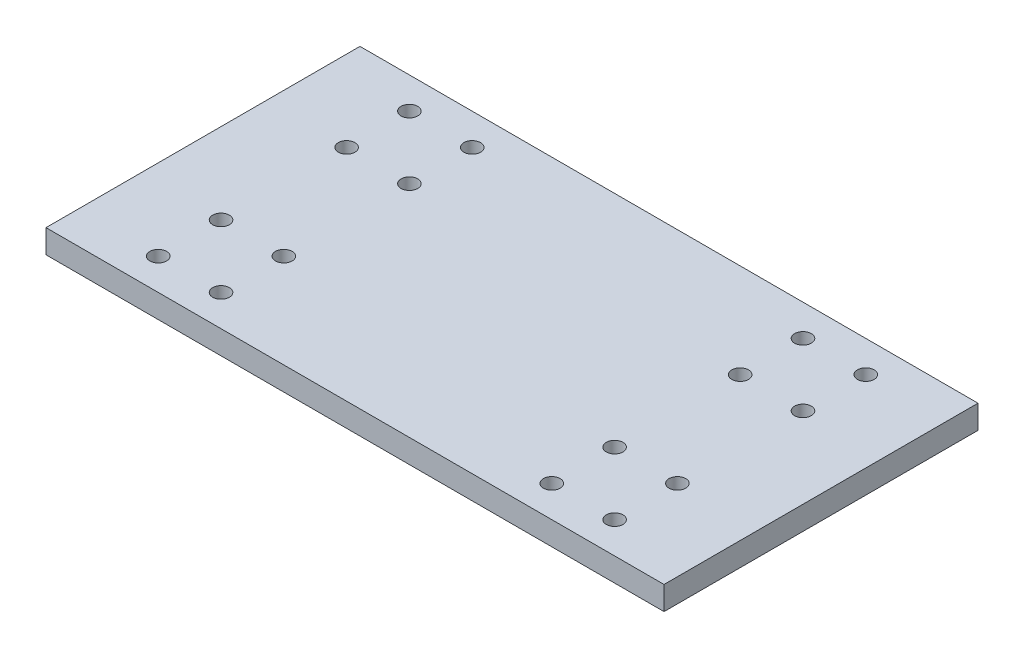
ISO-10303-21;
HEADER;
FILE_DESCRIPTION(('STEP AP214'),'2;1');
FILE_NAME('part.step','',(''),(''),'','','');
FILE_SCHEMA(('AUTOMOTIVE_DESIGN { 1 0 10303 214 1 1 1 1 }'));
ENDSEC;
DATA;
#1=APPLICATION_CONTEXT('core data for automotive mechanical design processes');
#2=APPLICATION_PROTOCOL_DEFINITION('international standard','automotive_design',2000,#1);
#3=PRODUCT_CONTEXT('',#1,'mechanical');
#4=PRODUCT('Part','Part','',(#3));
#5=PRODUCT_RELATED_PRODUCT_CATEGORY('part','',(#4));
#6=PRODUCT_DEFINITION_FORMATION('','',#4);
#7=PRODUCT_DEFINITION_CONTEXT('part definition',#1,'design');
#8=PRODUCT_DEFINITION('design','',#6,#7);
#9=PRODUCT_DEFINITION_SHAPE('','',#8);
#10=(LENGTH_UNIT() NAMED_UNIT(*) SI_UNIT(.MILLI.,.METRE.));
#11=(NAMED_UNIT(*) PLANE_ANGLE_UNIT() SI_UNIT($,.RADIAN.));
#12=(NAMED_UNIT(*) SI_UNIT($,.STERADIAN.) SOLID_ANGLE_UNIT());
#13=UNCERTAINTY_MEASURE_WITH_UNIT(LENGTH_MEASURE(1.E-05),#10,'distance_accuracy_value','');
#14=(GEOMETRIC_REPRESENTATION_CONTEXT(3) GLOBAL_UNCERTAINTY_ASSIGNED_CONTEXT((#13)) GLOBAL_UNIT_ASSIGNED_CONTEXT((#10,
#11,#12)) REPRESENTATION_CONTEXT('',''));
#15=CARTESIAN_POINT('',(0.,0.,0.));
#16=DIRECTION('',(0.,0.,1.));
#17=DIRECTION('',(1.,0.,0.));
#18=AXIS2_PLACEMENT_3D('',#15,#16,#17);
#19=CARTESIAN_POINT('',(49.4976423182434,0.,13.1975325749012));
#20=DIRECTION('',(0.,1.,0.));
#21=DIRECTION('',(1.,0.,0.));
#22=AXIS2_PLACEMENT_3D('',#19,#20,#21);
#23=PLANE('',#22);
#24=CARTESIAN_POINT('',(141.797642318243,0.,-12.2024674250987));
#25=DIRECTION('',(0.,1.,0.));
#26=DIRECTION('',(0.,0.,1.));
#27=AXIS2_PLACEMENT_3D('',#24,#25,#26);
#28=CIRCLE('',#27,3.378);
#29=CARTESIAN_POINT('',(141.797642318243,0.,-15.5804674250987));
#30=VERTEX_POINT('',#29);
#31=EDGE_CURVE('E287',#30,#30,#28,.T.);
#32=ORIENTED_EDGE('',*,*,#31,.T.);
#33=EDGE_LOOP('',(#32));
#34=FACE_BOUND('',#33,.T.);
#35=CARTESIAN_POINT('',(141.797642318243,0.,-37.6024674250987));
#36=DIRECTION('',(0.,1.,0.));
#37=DIRECTION('',(0.,0.,1.));
#38=AXIS2_PLACEMENT_3D('',#35,#36,#37);
#39=CIRCLE('',#38,3.378);
#40=CARTESIAN_POINT('',(141.797642318243,0.,-40.9804674250987));
#41=VERTEX_POINT('',#40);
#42=EDGE_CURVE('E236',#41,#41,#39,.T.);
#43=ORIENTED_EDGE('',*,*,#42,.T.);
#44=EDGE_LOOP('',(#43));
#45=FACE_BOUND('',#44,.T.);
#46=CARTESIAN_POINT('',(116.397642318243,0.,38.5975325749012));
#47=DIRECTION('',(0.,1.,0.));
#48=DIRECTION('',(0.,0.,1.));
#49=AXIS2_PLACEMENT_3D('',#46,#47,#48);
#50=CIRCLE('',#49,3.378);
#51=CARTESIAN_POINT('',(116.397642318243,0.,35.2195325749012));
#52=VERTEX_POINT('',#51);
#53=EDGE_CURVE('E246',#52,#52,#50,.T.);
#54=ORIENTED_EDGE('',*,*,#53,.T.);
#55=EDGE_LOOP('',(#54));
#56=FACE_BOUND('',#55,.T.);
#57=CARTESIAN_POINT('',(141.797642318243,0.,63.9975325749012));
#58=DIRECTION('',(0.,1.,0.));
#59=DIRECTION('',(0.,0.,1.));
#60=AXIS2_PLACEMENT_3D('',#57,#58,#59);
#61=CIRCLE('',#60,3.378);
#62=CARTESIAN_POINT('',(141.797642318243,0.,60.6195325749012));
#63=VERTEX_POINT('',#62);
#64=EDGE_CURVE('E260',#63,#63,#61,.T.);
#65=ORIENTED_EDGE('',*,*,#64,.T.);
#66=EDGE_LOOP('',(#65));
#67=FACE_BOUND('',#66,.T.);
#68=CARTESIAN_POINT('',(-42.8023576817566,0.,63.9975325749012));
#69=DIRECTION('',(0.,1.,0.));
#70=DIRECTION('',(0.,0.,1.));
#71=AXIS2_PLACEMENT_3D('',#68,#69,#70);
#72=CIRCLE('',#71,3.378);
#73=CARTESIAN_POINT('',(-42.8023576817566,0.,60.6195325749012));
#74=VERTEX_POINT('',#73);
#75=EDGE_CURVE('E279',#74,#74,#72,.T.);
#76=ORIENTED_EDGE('',*,*,#75,.T.);
#77=EDGE_LOOP('',(#76));
#78=FACE_BOUND('',#77,.T.);
#79=CARTESIAN_POINT('',(-17.4023576817566,0.,38.5975325749013));
#80=DIRECTION('',(0.,1.,0.));
#81=DIRECTION('',(0.,0.,1.));
#82=AXIS2_PLACEMENT_3D('',#79,#80,#81);
#83=CIRCLE('',#82,3.378);
#84=CARTESIAN_POINT('',(-17.4023576817566,0.,35.2195325749012));
#85=VERTEX_POINT('',#84);
#86=EDGE_CURVE('E187',#85,#85,#83,.T.);
#87=ORIENTED_EDGE('',*,*,#86,.T.);
#88=EDGE_LOOP('',(#87));
#89=FACE_BOUND('',#88,.T.);
#90=CARTESIAN_POINT('',(-17.4023576817566,0.,-12.2024674250987));
#91=DIRECTION('',(0.,1.,0.));
#92=DIRECTION('',(0.,0.,1.));
#93=AXIS2_PLACEMENT_3D('',#90,#91,#92);
#94=CIRCLE('',#93,3.378);
#95=CARTESIAN_POINT('',(-17.4023576817566,0.,-15.5804674250987));
#96=VERTEX_POINT('',#95);
#97=EDGE_CURVE('E189',#96,#96,#94,.T.);
#98=ORIENTED_EDGE('',*,*,#97,.T.);
#99=EDGE_LOOP('',(#98));
#100=FACE_BOUND('',#99,.T.);
#101=CARTESIAN_POINT('',(-17.4023576817566,0.,-37.6024674250987));
#102=DIRECTION('',(0.,1.,0.));
#103=DIRECTION('',(0.,0.,1.));
#104=AXIS2_PLACEMENT_3D('',#101,#102,#103);
#105=CIRCLE('',#104,3.378);
#106=CARTESIAN_POINT('',(-17.4023576817566,0.,-40.9804674250987));
#107=VERTEX_POINT('',#106);
#108=EDGE_CURVE('E211',#107,#107,#105,.T.);
#109=ORIENTED_EDGE('',*,*,#108,.T.);
#110=EDGE_LOOP('',(#109));
#111=FACE_BOUND('',#110,.T.);
#112=CARTESIAN_POINT('',(-42.8023576817566,0.,-37.6024674250987));
#113=DIRECTION('',(0.,1.,0.));
#114=DIRECTION('',(0.,0.,1.));
#115=AXIS2_PLACEMENT_3D('',#112,#113,#114);
#116=CIRCLE('',#115,3.378);
#117=CARTESIAN_POINT('',(-42.8023576817566,0.,-40.9804674250987));
#118=VERTEX_POINT('',#117);
#119=EDGE_CURVE('E173',#118,#118,#116,.T.);
#120=ORIENTED_EDGE('',*,*,#119,.T.);
#121=EDGE_LOOP('',(#120));
#122=FACE_BOUND('',#121,.T.);
#123=CARTESIAN_POINT('',(-42.8023576817566,0.,-12.2024674250988));
#124=DIRECTION('',(0.,1.,0.));
#125=DIRECTION('',(0.,0.,1.));
#126=AXIS2_PLACEMENT_3D('',#123,#124,#125);
#127=CIRCLE('',#126,3.378);
#128=CARTESIAN_POINT('',(-42.8023576817566,0.,-15.5804674250988));
#129=VERTEX_POINT('',#128);
#130=EDGE_CURVE('E216',#129,#129,#127,.T.);
#131=ORIENTED_EDGE('',*,*,#130,.T.);
#132=EDGE_LOOP('',(#131));
#133=FACE_BOUND('',#132,.T.);
#134=CARTESIAN_POINT('',(-42.8023576817566,0.,38.5975325749013));
#135=DIRECTION('',(0.,1.,0.));
#136=DIRECTION('',(0.,0.,1.));
#137=AXIS2_PLACEMENT_3D('',#134,#135,#136);
#138=CIRCLE('',#137,3.378);
#139=CARTESIAN_POINT('',(-42.8023576817566,0.,35.2195325749012));
#140=VERTEX_POINT('',#139);
#141=EDGE_CURVE('E318',#140,#140,#138,.T.);
#142=ORIENTED_EDGE('',*,*,#141,.T.);
#143=EDGE_LOOP('',(#142));
#144=FACE_BOUND('',#143,.T.);
#145=CARTESIAN_POINT('',(-17.4023576817566,0.,63.9975325749012));
#146=DIRECTION('',(0.,1.,0.));
#147=DIRECTION('',(0.,0.,1.));
#148=AXIS2_PLACEMENT_3D('',#145,#146,#147);
#149=CIRCLE('',#148,3.378);
#150=CARTESIAN_POINT('',(-17.4023576817566,0.,60.6195325749012));
#151=VERTEX_POINT('',#150);
#152=EDGE_CURVE('E307',#151,#151,#149,.T.);
#153=ORIENTED_EDGE('',*,*,#152,.T.);
#154=EDGE_LOOP('',(#153));
#155=FACE_BOUND('',#154,.T.);
#156=CARTESIAN_POINT('',(116.397642318243,0.,63.9975325749012));
#157=DIRECTION('',(0.,1.,0.));
#158=DIRECTION('',(0.,0.,1.));
#159=AXIS2_PLACEMENT_3D('',#156,#157,#158);
#160=CIRCLE('',#159,3.378);
#161=CARTESIAN_POINT('',(116.397642318243,0.,60.6195325749012));
#162=VERTEX_POINT('',#161);
#163=EDGE_CURVE('E229',#162,#162,#160,.T.);
#164=ORIENTED_EDGE('',*,*,#163,.T.);
#165=EDGE_LOOP('',(#164));
#166=FACE_BOUND('',#165,.T.);
#167=CARTESIAN_POINT('',(141.797642318243,0.,38.5975325749013));
#168=DIRECTION('',(0.,1.,0.));
#169=DIRECTION('',(0.,0.,1.));
#170=AXIS2_PLACEMENT_3D('',#167,#168,#169);
#171=CIRCLE('',#170,3.378);
#172=CARTESIAN_POINT('',(141.797642318243,0.,35.2195325749012));
#173=VERTEX_POINT('',#172);
#174=EDGE_CURVE('E222',#173,#173,#171,.T.);
#175=ORIENTED_EDGE('',*,*,#174,.T.);
#176=EDGE_LOOP('',(#175));
#177=FACE_BOUND('',#176,.T.);
#178=CARTESIAN_POINT('',(116.397642318243,0.,-12.2024674250987));
#179=DIRECTION('',(0.,1.,0.));
#180=DIRECTION('',(0.,0.,1.));
#181=AXIS2_PLACEMENT_3D('',#178,#179,#180);
#182=CIRCLE('',#181,3.378);
#183=CARTESIAN_POINT('',(116.397642318243,0.,-15.5804674250987));
#184=VERTEX_POINT('',#183);
#185=EDGE_CURVE('E237',#184,#184,#182,.T.);
#186=ORIENTED_EDGE('',*,*,#185,.T.);
#187=EDGE_LOOP('',(#186));
#188=FACE_BOUND('',#187,.T.);
#189=CARTESIAN_POINT('',(116.397642318243,0.,-37.6024674250987));
#190=DIRECTION('',(0.,1.,0.));
#191=DIRECTION('',(0.,0.,1.));
#192=AXIS2_PLACEMENT_3D('',#189,#190,#191);
#193=CIRCLE('',#192,3.378);
#194=CARTESIAN_POINT('',(116.397642318243,0.,-40.9804674250987));
#195=VERTEX_POINT('',#194);
#196=EDGE_CURVE('E303',#195,#195,#193,.T.);
#197=ORIENTED_EDGE('',*,*,#196,.T.);
#198=EDGE_LOOP('',(#197));
#199=FACE_BOUND('',#198,.T.);
#200=DIRECTION('',(-1.,0.,0.));
#201=VECTOR('',#200,1.);
#202=CARTESIAN_POINT('',(174.497642318243,0.,76.6975325749012));
#203=LINE('',#202,#201);
#204=CARTESIAN_POINT('',(174.497642318243,0.,76.6975325749012));
#205=VERTEX_POINT('',#204);
#206=CARTESIAN_POINT('',(-75.5023576817566,0.,76.6975325749012));
#207=VERTEX_POINT('',#206);
#208=EDGE_CURVE('E27',#205,#207,#203,.T.);
#209=ORIENTED_EDGE('',*,*,#208,.T.);
#210=DIRECTION('',(0.,0.,-1.));
#211=VECTOR('',#210,1.);
#212=CARTESIAN_POINT('',(-75.5023576817566,0.,76.6975325749012));
#213=LINE('',#212,#211);
#214=CARTESIAN_POINT('',(-75.5023576817566,0.,-50.3024674250988));
#215=VERTEX_POINT('',#214);
#216=EDGE_CURVE('E295',#207,#215,#213,.T.);
#217=ORIENTED_EDGE('',*,*,#216,.T.);
#218=DIRECTION('',(1.,0.,0.));
#219=VECTOR('',#218,1.);
#220=CARTESIAN_POINT('',(-75.5023576817566,0.,-50.3024674250988));
#221=LINE('',#220,#219);
#222=CARTESIAN_POINT('',(174.497642318243,0.,-50.3024674250988));
#223=VERTEX_POINT('',#222);
#224=EDGE_CURVE('E271',#215,#223,#221,.T.);
#225=ORIENTED_EDGE('',*,*,#224,.T.);
#226=DIRECTION('',(0.,0.,1.));
#227=VECTOR('',#226,1.);
#228=CARTESIAN_POINT('',(174.497642318243,0.,-50.3024674250988));
#229=LINE('',#228,#227);
#230=EDGE_CURVE('E245',#223,#205,#229,.T.);
#231=ORIENTED_EDGE('',*,*,#230,.T.);
#232=EDGE_LOOP('',(#209,#217,#225,#231));
#233=FACE_BOUND('',#232,.T.);
#234=ADVANCED_FACE('F16',(#34,#45,#56,#67,#78,#89,#100,#111,#122,#133,#144,#155,#166,#177,#188,
#199,#233),#23,.F.);
#235=CARTESIAN_POINT('',(49.4976423182434,9.525,13.1975325749012));
#236=DIRECTION('',(0.,1.,0.));
#237=DIRECTION('',(1.,0.,0.));
#238=AXIS2_PLACEMENT_3D('',#235,#236,#237);
#239=PLANE('',#238);
#240=CARTESIAN_POINT('',(141.797642318243,9.525,-12.2024674250987));
#241=DIRECTION('',(0.,-1.,0.));
#242=DIRECTION('',(0.,0.,1.));
#243=AXIS2_PLACEMENT_3D('',#240,#241,#242);
#244=CIRCLE('',#243,3.378);
#245=CARTESIAN_POINT('',(141.797642318243,9.525,-15.5804674250987));
#246=VERTEX_POINT('',#245);
#247=EDGE_CURVE('E231',#246,#246,#244,.T.);
#248=ORIENTED_EDGE('',*,*,#247,.T.);
#249=EDGE_LOOP('',(#248));
#250=FACE_BOUND('',#249,.T.);
#251=CARTESIAN_POINT('',(141.797642318243,9.525,-37.6024674250987));
#252=DIRECTION('',(0.,-1.,0.));
#253=DIRECTION('',(0.,0.,1.));
#254=AXIS2_PLACEMENT_3D('',#251,#252,#253);
#255=CIRCLE('',#254,3.378);
#256=CARTESIAN_POINT('',(141.797642318243,9.525,-40.9804674250987));
#257=VERTEX_POINT('',#256);
#258=EDGE_CURVE('E249',#257,#257,#255,.T.);
#259=ORIENTED_EDGE('',*,*,#258,.T.);
#260=EDGE_LOOP('',(#259));
#261=FACE_BOUND('',#260,.T.);
#262=CARTESIAN_POINT('',(116.397642318243,9.525,38.5975325749012));
#263=DIRECTION('',(0.,-1.,0.));
#264=DIRECTION('',(0.,0.,1.));
#265=AXIS2_PLACEMENT_3D('',#262,#263,#264);
#266=CIRCLE('',#265,3.378);
#267=CARTESIAN_POINT('',(116.397642318243,9.525,35.2195325749012));
#268=VERTEX_POINT('',#267);
#269=EDGE_CURVE('E256',#268,#268,#266,.T.);
#270=ORIENTED_EDGE('',*,*,#269,.T.);
#271=EDGE_LOOP('',(#270));
#272=FACE_BOUND('',#271,.T.);
#273=CARTESIAN_POINT('',(141.797642318243,9.525,63.9975325749012));
#274=DIRECTION('',(0.,-1.,0.));
#275=DIRECTION('',(0.,0.,1.));
#276=AXIS2_PLACEMENT_3D('',#273,#274,#275);
#277=CIRCLE('',#276,3.378);
#278=CARTESIAN_POINT('',(141.797642318243,9.525,60.6195325749012));
#279=VERTEX_POINT('',#278);
#280=EDGE_CURVE('E282',#279,#279,#277,.T.);
#281=ORIENTED_EDGE('',*,*,#280,.T.);
#282=EDGE_LOOP('',(#281));
#283=FACE_BOUND('',#282,.T.);
#284=CARTESIAN_POINT('',(-42.8023576817566,9.525,63.9975325749012));
#285=DIRECTION('',(0.,-1.,0.));
#286=DIRECTION('',(0.,0.,1.));
#287=AXIS2_PLACEMENT_3D('',#284,#285,#286);
#288=CIRCLE('',#287,3.378);
#289=CARTESIAN_POINT('',(-42.8023576817566,9.525,60.6195325749012));
#290=VERTEX_POINT('',#289);
#291=EDGE_CURVE('E353',#290,#290,#288,.T.);
#292=ORIENTED_EDGE('',*,*,#291,.T.);
#293=EDGE_LOOP('',(#292));
#294=FACE_BOUND('',#293,.T.);
#295=CARTESIAN_POINT('',(-17.4023576817566,9.525,38.5975325749013));
#296=DIRECTION('',(0.,-1.,0.));
#297=DIRECTION('',(0.,0.,1.));
#298=AXIS2_PLACEMENT_3D('',#295,#296,#297);
#299=CIRCLE('',#298,3.378);
#300=CARTESIAN_POINT('',(-17.4023576817566,9.525,35.2195325749012));
#301=VERTEX_POINT('',#300);
#302=EDGE_CURVE('E190',#301,#301,#299,.T.);
#303=ORIENTED_EDGE('',*,*,#302,.T.);
#304=EDGE_LOOP('',(#303));
#305=FACE_BOUND('',#304,.T.);
#306=CARTESIAN_POINT('',(-17.4023576817566,9.525,-12.2024674250987));
#307=DIRECTION('',(0.,-1.,0.));
#308=DIRECTION('',(0.,0.,1.));
#309=AXIS2_PLACEMENT_3D('',#306,#307,#308);
#310=CIRCLE('',#309,3.378);
#311=CARTESIAN_POINT('',(-17.4023576817566,9.525,-15.5804674250987));
#312=VERTEX_POINT('',#311);
#313=EDGE_CURVE('E201',#312,#312,#310,.T.);
#314=ORIENTED_EDGE('',*,*,#313,.T.);
#315=EDGE_LOOP('',(#314));
#316=FACE_BOUND('',#315,.T.);
#317=CARTESIAN_POINT('',(-17.4023576817566,9.525,-37.6024674250987));
#318=DIRECTION('',(0.,-1.,0.));
#319=DIRECTION('',(0.,0.,1.));
#320=AXIS2_PLACEMENT_3D('',#317,#318,#319);
#321=CIRCLE('',#320,3.378);
#322=CARTESIAN_POINT('',(-17.4023576817566,9.525,-40.9804674250987));
#323=VERTEX_POINT('',#322);
#324=EDGE_CURVE('E20',#323,#323,#321,.T.);
#325=ORIENTED_EDGE('',*,*,#324,.T.);
#326=EDGE_LOOP('',(#325));
#327=FACE_BOUND('',#326,.T.);
#328=CARTESIAN_POINT('',(-42.8023576817566,9.525,-37.6024674250987));
#329=DIRECTION('',(0.,-1.,0.));
#330=DIRECTION('',(0.,0.,1.));
#331=AXIS2_PLACEMENT_3D('',#328,#329,#330);
#332=CIRCLE('',#331,3.378);
#333=CARTESIAN_POINT('',(-42.8023576817566,9.525,-40.9804674250987));
#334=VERTEX_POINT('',#333);
#335=EDGE_CURVE('E184',#334,#334,#332,.T.);
#336=ORIENTED_EDGE('',*,*,#335,.T.);
#337=EDGE_LOOP('',(#336));
#338=FACE_BOUND('',#337,.T.);
#339=CARTESIAN_POINT('',(-42.8023576817566,9.525,-12.2024674250988));
#340=DIRECTION('',(0.,-1.,0.));
#341=DIRECTION('',(0.,0.,1.));
#342=AXIS2_PLACEMENT_3D('',#339,#340,#341);
#343=CIRCLE('',#342,3.378);
#344=CARTESIAN_POINT('',(-42.8023576817566,9.525,-15.5804674250988));
#345=VERTEX_POINT('',#344);
#346=EDGE_CURVE('E314',#345,#345,#343,.T.);
#347=ORIENTED_EDGE('',*,*,#346,.T.);
#348=EDGE_LOOP('',(#347));
#349=FACE_BOUND('',#348,.T.);
#350=CARTESIAN_POINT('',(-42.8023576817566,9.525,38.5975325749013));
#351=DIRECTION('',(0.,-1.,0.));
#352=DIRECTION('',(0.,0.,1.));
#353=AXIS2_PLACEMENT_3D('',#350,#351,#352);
#354=CIRCLE('',#353,3.378);
#355=CARTESIAN_POINT('',(-42.8023576817566,9.525,35.2195325749012));
#356=VERTEX_POINT('',#355);
#357=EDGE_CURVE('E310',#356,#356,#354,.T.);
#358=ORIENTED_EDGE('',*,*,#357,.T.);
#359=EDGE_LOOP('',(#358));
#360=FACE_BOUND('',#359,.T.);
#361=CARTESIAN_POINT('',(-17.4023576817566,9.525,63.9975325749012));
#362=DIRECTION('',(0.,-1.,0.));
#363=DIRECTION('',(0.,0.,1.));
#364=AXIS2_PLACEMENT_3D('',#361,#362,#363);
#365=CIRCLE('',#364,3.378);
#366=CARTESIAN_POINT('',(-17.4023576817566,9.525,60.6195325749012));
#367=VERTEX_POINT('',#366);
#368=EDGE_CURVE('E251',#367,#367,#365,.T.);
#369=ORIENTED_EDGE('',*,*,#368,.T.);
#370=EDGE_LOOP('',(#369));
#371=FACE_BOUND('',#370,.T.);
#372=CARTESIAN_POINT('',(116.397642318243,9.525,63.9975325749012));
#373=DIRECTION('',(0.,-1.,0.));
#374=DIRECTION('',(0.,0.,1.));
#375=AXIS2_PLACEMENT_3D('',#372,#373,#374);
#376=CIRCLE('',#375,3.378);
#377=CARTESIAN_POINT('',(116.397642318243,9.525,60.6195325749012));
#378=VERTEX_POINT('',#377);
#379=EDGE_CURVE('E230',#378,#378,#376,.T.);
#380=ORIENTED_EDGE('',*,*,#379,.T.);
#381=EDGE_LOOP('',(#380));
#382=FACE_BOUND('',#381,.T.);
#383=CARTESIAN_POINT('',(141.797642318243,9.525,38.5975325749013));
#384=DIRECTION('',(0.,-1.,0.));
#385=DIRECTION('',(0.,0.,1.));
#386=AXIS2_PLACEMENT_3D('',#383,#384,#385);
#387=CIRCLE('',#386,3.378);
#388=CARTESIAN_POINT('',(141.797642318243,9.525,35.2195325749012));
#389=VERTEX_POINT('',#388);
#390=EDGE_CURVE('E223',#389,#389,#387,.T.);
#391=ORIENTED_EDGE('',*,*,#390,.T.);
#392=EDGE_LOOP('',(#391));
#393=FACE_BOUND('',#392,.T.);
#394=CARTESIAN_POINT('',(116.397642318243,9.525,-12.2024674250987));
#395=DIRECTION('',(0.,-1.,0.));
#396=DIRECTION('',(0.,0.,1.));
#397=AXIS2_PLACEMENT_3D('',#394,#395,#396);
#398=CIRCLE('',#397,3.378);
#399=CARTESIAN_POINT('',(116.397642318243,9.525,-15.5804674250987));
#400=VERTEX_POINT('',#399);
#401=EDGE_CURVE('E302',#400,#400,#398,.T.);
#402=ORIENTED_EDGE('',*,*,#401,.T.);
#403=EDGE_LOOP('',(#402));
#404=FACE_BOUND('',#403,.T.);
#405=CARTESIAN_POINT('',(116.397642318243,9.525,-37.6024674250987));
#406=DIRECTION('',(0.,-1.,0.));
#407=DIRECTION('',(0.,0.,1.));
#408=AXIS2_PLACEMENT_3D('',#405,#406,#407);
#409=CIRCLE('',#408,3.378);
#410=CARTESIAN_POINT('',(116.397642318243,9.525,-40.9804674250987));
#411=VERTEX_POINT('',#410);
#412=EDGE_CURVE('E343',#411,#411,#409,.T.);
#413=ORIENTED_EDGE('',*,*,#412,.T.);
#414=EDGE_LOOP('',(#413));
#415=FACE_BOUND('',#414,.T.);
#416=DIRECTION('',(1.,0.,0.));
#417=VECTOR('',#416,1.);
#418=CARTESIAN_POINT('',(174.497642318243,9.525,76.6975325749012));
#419=LINE('',#418,#417);
#420=CARTESIAN_POINT('',(-75.5023576817566,9.525,76.6975325749012));
#421=VERTEX_POINT('',#420);
#422=CARTESIAN_POINT('',(174.497642318243,9.525,76.6975325749012));
#423=VERTEX_POINT('',#422);
#424=EDGE_CURVE('E11',#421,#423,#419,.T.);
#425=ORIENTED_EDGE('',*,*,#424,.T.);
#426=DIRECTION('',(0.,0.,-1.));
#427=VECTOR('',#426,1.);
#428=CARTESIAN_POINT('',(174.497642318243,9.525,-50.3024674250988));
#429=LINE('',#428,#427);
#430=CARTESIAN_POINT('',(174.497642318243,9.525,-50.3024674250988));
#431=VERTEX_POINT('',#430);
#432=EDGE_CURVE('E241',#423,#431,#429,.T.);
#433=ORIENTED_EDGE('',*,*,#432,.T.);
#434=DIRECTION('',(-1.,0.,0.));
#435=VECTOR('',#434,1.);
#436=CARTESIAN_POINT('',(-75.5023576817566,9.525,-50.3024674250988));
#437=LINE('',#436,#435);
#438=CARTESIAN_POINT('',(-75.5023576817566,9.525,-50.3024674250988));
#439=VERTEX_POINT('',#438);
#440=EDGE_CURVE('E275',#431,#439,#437,.T.);
#441=ORIENTED_EDGE('',*,*,#440,.T.);
#442=DIRECTION('',(0.,0.,1.));
#443=VECTOR('',#442,1.);
#444=CARTESIAN_POINT('',(-75.5023576817566,9.525,76.6975325749012));
#445=LINE('',#444,#443);
#446=EDGE_CURVE('E360',#439,#421,#445,.T.);
#447=ORIENTED_EDGE('',*,*,#446,.T.);
#448=EDGE_LOOP('',(#425,#433,#441,#447));
#449=FACE_BOUND('',#448,.T.);
#450=ADVANCED_FACE('F416',(#250,#261,#272,#283,#294,#305,#316,#327,#338,#349,#360,#371,#382,
#393,#404,#415,#449),#239,.T.);
#451=CARTESIAN_POINT('',(-75.5023576817566,0.,76.6975325749012));
#452=DIRECTION('',(0.,0.,1.));
#453=DIRECTION('',(1.,0.,0.));
#454=AXIS2_PLACEMENT_3D('',#451,#452,#453);
#455=PLANE('',#454);
#456=ORIENTED_EDGE('',*,*,#208,.F.);
#457=DIRECTION('',(0.,1.,0.));
#458=VECTOR('',#457,1.);
#459=CARTESIAN_POINT('',(174.497642318243,0.,76.6975325749012));
#460=LINE('',#459,#458);
#461=EDGE_CURVE('E244',#205,#423,#460,.T.);
#462=ORIENTED_EDGE('',*,*,#461,.T.);
#463=ORIENTED_EDGE('',*,*,#424,.F.);
#464=DIRECTION('',(0.,1.,0.));
#465=VECTOR('',#464,1.);
#466=CARTESIAN_POINT('',(-75.5023576817566,0.,76.6975325749012));
#467=LINE('',#466,#465);
#468=EDGE_CURVE('E363',#207,#421,#467,.T.);
#469=ORIENTED_EDGE('',*,*,#468,.F.);
#470=EDGE_LOOP('',(#456,#462,#463,#469));
#471=FACE_BOUND('',#470,.T.);
#472=ADVANCED_FACE('F419',(#471),#455,.T.);
#473=CARTESIAN_POINT('',(174.497642318243,0.,76.6975325749012));
#474=DIRECTION('',(1.,0.,0.));
#475=DIRECTION('',(0.,0.,1.));
#476=AXIS2_PLACEMENT_3D('',#473,#474,#475);
#477=PLANE('',#476);
#478=ORIENTED_EDGE('',*,*,#230,.F.);
#479=DIRECTION('',(0.,1.,0.));
#480=VECTOR('',#479,1.);
#481=CARTESIAN_POINT('',(174.497642318243,0.,-50.3024674250988));
#482=LINE('',#481,#480);
#483=EDGE_CURVE('E268',#223,#431,#482,.T.);
#484=ORIENTED_EDGE('',*,*,#483,.T.);
#485=ORIENTED_EDGE('',*,*,#432,.F.);
#486=ORIENTED_EDGE('',*,*,#461,.F.);
#487=EDGE_LOOP('',(#478,#484,#485,#486));
#488=FACE_BOUND('',#487,.T.);
#489=ADVANCED_FACE('F506',(#488),#477,.T.);
#490=CARTESIAN_POINT('',(174.497642318243,0.,-50.3024674250988));
#491=DIRECTION('',(0.,0.,-1.));
#492=DIRECTION('',(0.,-1.,0.));
#493=AXIS2_PLACEMENT_3D('',#490,#491,#492);
#494=PLANE('',#493);
#495=ORIENTED_EDGE('',*,*,#224,.F.);
#496=DIRECTION('',(0.,1.,0.));
#497=VECTOR('',#496,1.);
#498=CARTESIAN_POINT('',(-75.5023576817566,0.,-50.3024674250988));
#499=LINE('',#498,#497);
#500=EDGE_CURVE('E276',#215,#439,#499,.T.);
#501=ORIENTED_EDGE('',*,*,#500,.T.);
#502=ORIENTED_EDGE('',*,*,#440,.F.);
#503=ORIENTED_EDGE('',*,*,#483,.F.);
#504=EDGE_LOOP('',(#495,#501,#502,#503));
#505=FACE_BOUND('',#504,.T.);
#506=ADVANCED_FACE('F454',(#505),#494,.T.);
#507=CARTESIAN_POINT('',(-75.5023576817566,0.,-50.3024674250988));
#508=DIRECTION('',(-1.,0.,0.));
#509=DIRECTION('',(0.,0.,1.));
#510=AXIS2_PLACEMENT_3D('',#507,#508,#509);
#511=PLANE('',#510);
#512=ORIENTED_EDGE('',*,*,#216,.F.);
#513=ORIENTED_EDGE('',*,*,#468,.T.);
#514=ORIENTED_EDGE('',*,*,#446,.F.);
#515=ORIENTED_EDGE('',*,*,#500,.F.);
#516=EDGE_LOOP('',(#512,#513,#514,#515));
#517=FACE_BOUND('',#516,.T.);
#518=ADVANCED_FACE('F18',(#517),#511,.T.);
#519=CARTESIAN_POINT('',(141.797642318243,2.025,-12.2024674250987));
#520=DIRECTION('',(0.,-1.,0.));
#521=DIRECTION('',(0.,0.,1.));
#522=AXIS2_PLACEMENT_3D('',#519,#520,#521);
#523=CYLINDRICAL_SURFACE('',#522,3.378);
#524=ORIENTED_EDGE('',*,*,#247,.F.);
#525=DIRECTION('',(0.,-1.,0.));
#526=VECTOR('',#525,1.);
#527=CARTESIAN_POINT('',(141.797642318243,2.025,-15.5804674250987));
#528=LINE('',#527,#526);
#529=EDGE_CURVE('E235',#246,#30,#528,.T.);
#530=ORIENTED_EDGE('',*,*,#529,.T.);
#531=ORIENTED_EDGE('',*,*,#31,.F.);
#532=ORIENTED_EDGE('',*,*,#529,.F.);
#533=EDGE_LOOP('',(#524,#530,#531,#532));
#534=FACE_BOUND('',#533,.T.);
#535=ADVANCED_FACE('F497',(#534),#523,.F.);
#536=CARTESIAN_POINT('',(141.797642318243,2.025,-37.6024674250987));
#537=DIRECTION('',(0.,-1.,0.));
#538=DIRECTION('',(0.,0.,1.));
#539=AXIS2_PLACEMENT_3D('',#536,#537,#538);
#540=CYLINDRICAL_SURFACE('',#539,3.378);
#541=ORIENTED_EDGE('',*,*,#258,.F.);
#542=DIRECTION('',(0.,-1.,0.));
#543=VECTOR('',#542,1.);
#544=CARTESIAN_POINT('',(141.797642318243,2.025,-40.9804674250987));
#545=LINE('',#544,#543);
#546=EDGE_CURVE('E264',#257,#41,#545,.T.);
#547=ORIENTED_EDGE('',*,*,#546,.T.);
#548=ORIENTED_EDGE('',*,*,#42,.F.);
#549=ORIENTED_EDGE('',*,*,#546,.F.);
#550=EDGE_LOOP('',(#541,#547,#548,#549));
#551=FACE_BOUND('',#550,.T.);
#552=ADVANCED_FACE('F500',(#551),#540,.F.);
#553=CARTESIAN_POINT('',(116.397642318243,2.025,38.5975325749012));
#554=DIRECTION('',(0.,-1.,0.));
#555=DIRECTION('',(0.,0.,1.));
#556=AXIS2_PLACEMENT_3D('',#553,#554,#555);
#557=CYLINDRICAL_SURFACE('',#556,3.378);
#558=ORIENTED_EDGE('',*,*,#269,.F.);
#559=DIRECTION('',(0.,-1.,0.));
#560=VECTOR('',#559,1.);
#561=CARTESIAN_POINT('',(116.397642318243,2.025,35.2195325749012));
#562=LINE('',#561,#560);
#563=EDGE_CURVE('E250',#268,#52,#562,.T.);
#564=ORIENTED_EDGE('',*,*,#563,.T.);
#565=ORIENTED_EDGE('',*,*,#53,.F.);
#566=ORIENTED_EDGE('',*,*,#563,.F.);
#567=EDGE_LOOP('',(#558,#564,#565,#566));
#568=FACE_BOUND('',#567,.T.);
#569=ADVANCED_FACE('F532',(#568),#557,.F.);
#570=CARTESIAN_POINT('',(141.797642318243,2.025,63.9975325749012));
#571=DIRECTION('',(0.,-1.,0.));
#572=DIRECTION('',(0.,0.,1.));
#573=AXIS2_PLACEMENT_3D('',#570,#571,#572);
#574=CYLINDRICAL_SURFACE('',#573,3.378);
#575=ORIENTED_EDGE('',*,*,#280,.F.);
#576=DIRECTION('',(0.,-1.,0.));
#577=VECTOR('',#576,1.);
#578=CARTESIAN_POINT('',(141.797642318243,2.025,60.6195325749012));
#579=LINE('',#578,#577);
#580=EDGE_CURVE('E321',#279,#63,#579,.T.);
#581=ORIENTED_EDGE('',*,*,#580,.T.);
#582=ORIENTED_EDGE('',*,*,#64,.F.);
#583=ORIENTED_EDGE('',*,*,#580,.F.);
#584=EDGE_LOOP('',(#575,#581,#582,#583));
#585=FACE_BOUND('',#584,.T.);
#586=ADVANCED_FACE('F491',(#585),#574,.F.);
#587=CARTESIAN_POINT('',(-42.8023576817566,2.025,63.9975325749012));
#588=DIRECTION('',(0.,-1.,0.));
#589=DIRECTION('',(0.,0.,1.));
#590=AXIS2_PLACEMENT_3D('',#587,#588,#589);
#591=CYLINDRICAL_SURFACE('',#590,3.378);
#592=ORIENTED_EDGE('',*,*,#291,.F.);
#593=DIRECTION('',(0.,-1.,0.));
#594=VECTOR('',#593,1.);
#595=CARTESIAN_POINT('',(-42.8023576817566,2.025,60.6195325749012));
#596=LINE('',#595,#594);
#597=EDGE_CURVE('E283',#290,#74,#596,.T.);
#598=ORIENTED_EDGE('',*,*,#597,.T.);
#599=ORIENTED_EDGE('',*,*,#75,.F.);
#600=ORIENTED_EDGE('',*,*,#597,.F.);
#601=EDGE_LOOP('',(#592,#598,#599,#600));
#602=FACE_BOUND('',#601,.T.);
#603=ADVANCED_FACE('F414',(#602),#591,.F.);
#604=CARTESIAN_POINT('',(-17.4023576817566,2.025,38.5975325749013));
#605=DIRECTION('',(0.,-1.,0.));
#606=DIRECTION('',(0.,0.,1.));
#607=AXIS2_PLACEMENT_3D('',#604,#605,#606);
#608=CYLINDRICAL_SURFACE('',#607,3.378);
#609=ORIENTED_EDGE('',*,*,#302,.F.);
#610=DIRECTION('',(0.,-1.,0.));
#611=VECTOR('',#610,1.);
#612=CARTESIAN_POINT('',(-17.4023576817566,2.025,35.2195325749012));
#613=LINE('',#612,#611);
#614=EDGE_CURVE('E197',#301,#85,#613,.T.);
#615=ORIENTED_EDGE('',*,*,#614,.T.);
#616=ORIENTED_EDGE('',*,*,#86,.F.);
#617=ORIENTED_EDGE('',*,*,#614,.F.);
#618=EDGE_LOOP('',(#609,#615,#616,#617));
#619=FACE_BOUND('',#618,.T.);
#620=ADVANCED_FACE('F480',(#619),#608,.F.);
#621=CARTESIAN_POINT('',(-17.4023576817566,2.025,-12.2024674250987));
#622=DIRECTION('',(0.,-1.,0.));
#623=DIRECTION('',(0.,0.,1.));
#624=AXIS2_PLACEMENT_3D('',#621,#622,#623);
#625=CYLINDRICAL_SURFACE('',#624,3.378);
#626=ORIENTED_EDGE('',*,*,#313,.F.);
#627=DIRECTION('',(0.,-1.,0.));
#628=VECTOR('',#627,1.);
#629=CARTESIAN_POINT('',(-17.4023576817566,2.025,-15.5804674250987));
#630=LINE('',#629,#628);
#631=EDGE_CURVE('E191',#312,#96,#630,.T.);
#632=ORIENTED_EDGE('',*,*,#631,.T.);
#633=ORIENTED_EDGE('',*,*,#97,.F.);
#634=ORIENTED_EDGE('',*,*,#631,.F.);
#635=EDGE_LOOP('',(#626,#632,#633,#634));
#636=FACE_BOUND('',#635,.T.);
#637=ADVANCED_FACE('F482',(#636),#625,.F.);
#638=CARTESIAN_POINT('',(-17.4023576817566,2.025,-37.6024674250987));
#639=DIRECTION('',(0.,-1.,0.));
#640=DIRECTION('',(0.,0.,1.));
#641=AXIS2_PLACEMENT_3D('',#638,#639,#640);
#642=CYLINDRICAL_SURFACE('',#641,3.378);
#643=ORIENTED_EDGE('',*,*,#324,.F.);
#644=DIRECTION('',(0.,-1.,0.));
#645=VECTOR('',#644,1.);
#646=CARTESIAN_POINT('',(-17.4023576817566,2.025,-40.9804674250987));
#647=LINE('',#646,#645);
#648=EDGE_CURVE('E182',#323,#107,#647,.T.);
#649=ORIENTED_EDGE('',*,*,#648,.T.);
#650=ORIENTED_EDGE('',*,*,#108,.F.);
#651=ORIENTED_EDGE('',*,*,#648,.F.);
#652=EDGE_LOOP('',(#643,#649,#650,#651));
#653=FACE_BOUND('',#652,.T.);
#654=ADVANCED_FACE('F489',(#653),#642,.F.);
#655=CARTESIAN_POINT('',(-42.8023576817566,2.025,-37.6024674250987));
#656=DIRECTION('',(0.,-1.,0.));
#657=DIRECTION('',(0.,0.,1.));
#658=AXIS2_PLACEMENT_3D('',#655,#656,#657);
#659=CYLINDRICAL_SURFACE('',#658,3.378);
#660=ORIENTED_EDGE('',*,*,#335,.F.);
#661=DIRECTION('',(0.,-1.,0.));
#662=VECTOR('',#661,1.);
#663=CARTESIAN_POINT('',(-42.8023576817566,2.025,-40.9804674250987));
#664=LINE('',#663,#662);
#665=EDGE_CURVE('E167',#334,#118,#664,.T.);
#666=ORIENTED_EDGE('',*,*,#665,.T.);
#667=ORIENTED_EDGE('',*,*,#119,.F.);
#668=ORIENTED_EDGE('',*,*,#665,.F.);
#669=EDGE_LOOP('',(#660,#666,#667,#668));
#670=FACE_BOUND('',#669,.T.);
#671=ADVANCED_FACE('F510',(#670),#659,.F.);
#672=CARTESIAN_POINT('',(-42.8023576817566,2.025,-12.2024674250988));
#673=DIRECTION('',(0.,-1.,0.));
#674=DIRECTION('',(0.,0.,1.));
#675=AXIS2_PLACEMENT_3D('',#672,#673,#674);
#676=CYLINDRICAL_SURFACE('',#675,3.378);
#677=ORIENTED_EDGE('',*,*,#346,.F.);
#678=DIRECTION('',(0.,-1.,0.));
#679=VECTOR('',#678,1.);
#680=CARTESIAN_POINT('',(-42.8023576817566,2.025,-15.5804674250988));
#681=LINE('',#680,#679);
#682=EDGE_CURVE('E218',#345,#129,#681,.T.);
#683=ORIENTED_EDGE('',*,*,#682,.T.);
#684=ORIENTED_EDGE('',*,*,#130,.F.);
#685=ORIENTED_EDGE('',*,*,#682,.F.);
#686=EDGE_LOOP('',(#677,#683,#684,#685));
#687=FACE_BOUND('',#686,.T.);
#688=ADVANCED_FACE('F512',(#687),#676,.F.);
#689=CARTESIAN_POINT('',(-42.8023576817566,2.025,38.5975325749013));
#690=DIRECTION('',(0.,-1.,0.));
#691=DIRECTION('',(0.,0.,1.));
#692=AXIS2_PLACEMENT_3D('',#689,#690,#691);
#693=CYLINDRICAL_SURFACE('',#692,3.378);
#694=ORIENTED_EDGE('',*,*,#357,.F.);
#695=DIRECTION('',(0.,-1.,0.));
#696=VECTOR('',#695,1.);
#697=CARTESIAN_POINT('',(-42.8023576817566,2.025,35.2195325749012));
#698=LINE('',#697,#696);
#699=EDGE_CURVE('E330',#356,#140,#698,.T.);
#700=ORIENTED_EDGE('',*,*,#699,.T.);
#701=ORIENTED_EDGE('',*,*,#141,.F.);
#702=ORIENTED_EDGE('',*,*,#699,.F.);
#703=EDGE_LOOP('',(#694,#700,#701,#702));
#704=FACE_BOUND('',#703,.T.);
#705=ADVANCED_FACE('F525',(#704),#693,.F.);
#706=CARTESIAN_POINT('',(-17.4023576817566,2.025,63.9975325749012));
#707=DIRECTION('',(0.,-1.,0.));
#708=DIRECTION('',(0.,0.,1.));
#709=AXIS2_PLACEMENT_3D('',#706,#707,#708);
#710=CYLINDRICAL_SURFACE('',#709,3.378);
#711=ORIENTED_EDGE('',*,*,#368,.F.);
#712=DIRECTION('',(0.,-1.,0.));
#713=VECTOR('',#712,1.);
#714=CARTESIAN_POINT('',(-17.4023576817566,2.025,60.6195325749012));
#715=LINE('',#714,#713);
#716=EDGE_CURVE('E255',#367,#151,#715,.T.);
#717=ORIENTED_EDGE('',*,*,#716,.T.);
#718=ORIENTED_EDGE('',*,*,#152,.F.);
#719=ORIENTED_EDGE('',*,*,#716,.F.);
#720=EDGE_LOOP('',(#711,#717,#718,#719));
#721=FACE_BOUND('',#720,.T.);
#722=ADVANCED_FACE('F495',(#721),#710,.F.);
#723=CARTESIAN_POINT('',(116.397642318243,2.025,63.9975325749012));
#724=DIRECTION('',(0.,-1.,0.));
#725=DIRECTION('',(0.,0.,1.));
#726=AXIS2_PLACEMENT_3D('',#723,#724,#725);
#727=CYLINDRICAL_SURFACE('',#726,3.378);
#728=ORIENTED_EDGE('',*,*,#379,.F.);
#729=DIRECTION('',(0.,-1.,0.));
#730=VECTOR('',#729,1.);
#731=CARTESIAN_POINT('',(116.397642318243,2.025,60.6195325749012));
#732=LINE('',#731,#730);
#733=EDGE_CURVE('E225',#378,#162,#732,.T.);
#734=ORIENTED_EDGE('',*,*,#733,.T.);
#735=ORIENTED_EDGE('',*,*,#163,.F.);
#736=ORIENTED_EDGE('',*,*,#733,.F.);
#737=EDGE_LOOP('',(#728,#734,#735,#736));
#738=FACE_BOUND('',#737,.T.);
#739=ADVANCED_FACE('F502',(#738),#727,.F.);
#740=CARTESIAN_POINT('',(141.797642318243,2.025,38.5975325749013));
#741=DIRECTION('',(0.,-1.,0.));
#742=DIRECTION('',(0.,0.,1.));
#743=AXIS2_PLACEMENT_3D('',#740,#741,#742);
#744=CYLINDRICAL_SURFACE('',#743,3.378);
#745=ORIENTED_EDGE('',*,*,#390,.F.);
#746=DIRECTION('',(0.,-1.,0.));
#747=VECTOR('',#746,1.);
#748=CARTESIAN_POINT('',(141.797642318243,2.025,35.2195325749012));
#749=LINE('',#748,#747);
#750=EDGE_CURVE('E219',#389,#173,#749,.T.);
#751=ORIENTED_EDGE('',*,*,#750,.T.);
#752=ORIENTED_EDGE('',*,*,#174,.F.);
#753=ORIENTED_EDGE('',*,*,#750,.F.);
#754=EDGE_LOOP('',(#745,#751,#752,#753));
#755=FACE_BOUND('',#754,.T.);
#756=ADVANCED_FACE('F396',(#755),#744,.F.);
#757=CARTESIAN_POINT('',(116.397642318243,2.025,-12.2024674250987));
#758=DIRECTION('',(0.,-1.,0.));
#759=DIRECTION('',(0.,0.,1.));
#760=AXIS2_PLACEMENT_3D('',#757,#758,#759);
#761=CYLINDRICAL_SURFACE('',#760,3.378);
#762=ORIENTED_EDGE('',*,*,#401,.F.);
#763=DIRECTION('',(0.,-1.,0.));
#764=VECTOR('',#763,1.);
#765=CARTESIAN_POINT('',(116.397642318243,2.025,-15.5804674250987));
#766=LINE('',#765,#764);
#767=EDGE_CURVE('E240',#400,#184,#766,.T.);
#768=ORIENTED_EDGE('',*,*,#767,.T.);
#769=ORIENTED_EDGE('',*,*,#185,.F.);
#770=ORIENTED_EDGE('',*,*,#767,.F.);
#771=EDGE_LOOP('',(#762,#768,#769,#770));
#772=FACE_BOUND('',#771,.T.);
#773=ADVANCED_FACE('F514',(#772),#761,.F.);
#774=CARTESIAN_POINT('',(116.397642318243,2.025,-37.6024674250987));
#775=DIRECTION('',(0.,-1.,0.));
#776=DIRECTION('',(0.,0.,1.));
#777=AXIS2_PLACEMENT_3D('',#774,#775,#776);
#778=CYLINDRICAL_SURFACE('',#777,3.378);
#779=ORIENTED_EDGE('',*,*,#412,.F.);
#780=DIRECTION('',(0.,-1.,0.));
#781=VECTOR('',#780,1.);
#782=CARTESIAN_POINT('',(116.397642318243,2.025,-40.9804674250987));
#783=LINE('',#782,#781);
#784=EDGE_CURVE('E306',#411,#195,#783,.T.);
#785=ORIENTED_EDGE('',*,*,#784,.T.);
#786=ORIENTED_EDGE('',*,*,#196,.F.);
#787=ORIENTED_EDGE('',*,*,#784,.F.);
#788=EDGE_LOOP('',(#779,#785,#786,#787));
#789=FACE_BOUND('',#788,.T.);
#790=ADVANCED_FACE('F440',(#789),#778,.F.);
#791=CLOSED_SHELL('',(#234,#450,#472,#489,#506,#518,#535,#552,#569,#586,#603,#620,#637,#654,
#671,#688,#705,#722,#739,#756,#773,#790));
#792=MANIFOLD_SOLID_BREP('B1',#791);
#793=ADVANCED_BREP_SHAPE_REPRESENTATION('',(#18,#792),#14);
#794=SHAPE_DEFINITION_REPRESENTATION(#9,#793);
ENDSEC;
END-ISO-10303-21;
